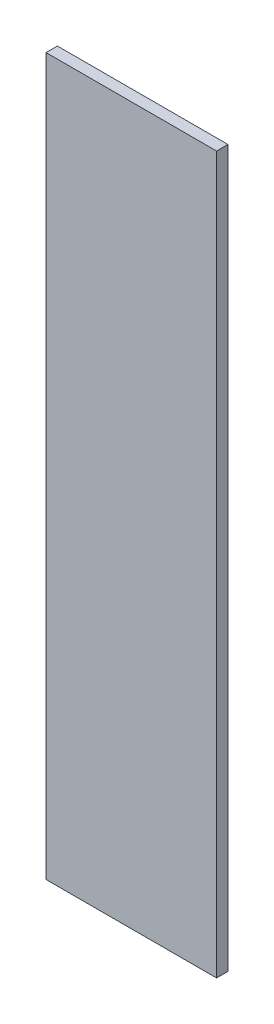
ISO-10303-21;
HEADER;
FILE_DESCRIPTION(('STEP AP214'),'2;1');
FILE_NAME('part.step','',(''),(''),'','','');
FILE_SCHEMA(('AUTOMOTIVE_DESIGN { 1 0 10303 214 1 1 1 1 }'));
ENDSEC;
DATA;
#1=APPLICATION_CONTEXT('core data for automotive mechanical design processes');
#2=APPLICATION_PROTOCOL_DEFINITION('international standard','automotive_design',2000,#1);
#3=PRODUCT_CONTEXT('',#1,'mechanical');
#4=PRODUCT('Part','Part','',(#3));
#5=PRODUCT_RELATED_PRODUCT_CATEGORY('part','',(#4));
#6=PRODUCT_DEFINITION_FORMATION('','',#4);
#7=PRODUCT_DEFINITION_CONTEXT('part definition',#1,'design');
#8=PRODUCT_DEFINITION('design','',#6,#7);
#9=PRODUCT_DEFINITION_SHAPE('','',#8);
#10=(LENGTH_UNIT() NAMED_UNIT(*) SI_UNIT(.MILLI.,.METRE.));
#11=(NAMED_UNIT(*) PLANE_ANGLE_UNIT() SI_UNIT($,.RADIAN.));
#12=(NAMED_UNIT(*) SI_UNIT($,.STERADIAN.) SOLID_ANGLE_UNIT());
#13=UNCERTAINTY_MEASURE_WITH_UNIT(LENGTH_MEASURE(1.E-05),#10,'distance_accuracy_value','');
#14=(GEOMETRIC_REPRESENTATION_CONTEXT(3) GLOBAL_UNCERTAINTY_ASSIGNED_CONTEXT((#13)) GLOBAL_UNIT_ASSIGNED_CONTEXT((#10,
#11,#12)) REPRESENTATION_CONTEXT('',''));
#15=CARTESIAN_POINT('',(0.,0.,0.));
#16=DIRECTION('',(0.,0.,1.));
#17=DIRECTION('',(1.,0.,0.));
#18=AXIS2_PLACEMENT_3D('',#15,#16,#17);
#19=CARTESIAN_POINT('',(0.,0.,2.));
#20=DIRECTION('',(1.,0.,0.));
#21=DIRECTION('',(0.,0.,-1.));
#22=AXIS2_PLACEMENT_3D('',#19,#20,#21);
#23=PLANE('',#22);
#24=DIRECTION('',(0.,-1.,0.));
#25=VECTOR('',#24,1.);
#26=CARTESIAN_POINT('',(0.,0.,0.));
#27=LINE('',#26,#25);
#28=CARTESIAN_POINT('',(0.,126.,0.));
#29=VERTEX_POINT('',#28);
#30=CARTESIAN_POINT('',(0.,0.,0.));
#31=VERTEX_POINT('',#30);
#32=EDGE_CURVE('E108',#29,#31,#27,.T.);
#33=ORIENTED_EDGE('',*,*,#32,.T.);
#34=DIRECTION('',(0.,0.,-1.));
#35=VECTOR('',#34,1.);
#36=CARTESIAN_POINT('',(0.,0.,2.));
#37=LINE('',#36,#35);
#38=CARTESIAN_POINT('',(0.,0.,2.));
#39=VERTEX_POINT('',#38);
#40=EDGE_CURVE('E11',#39,#31,#37,.T.);
#41=ORIENTED_EDGE('',*,*,#40,.F.);
#42=DIRECTION('',(0.,-1.,0.));
#43=VECTOR('',#42,1.);
#44=CARTESIAN_POINT('',(0.,0.,2.));
#45=LINE('',#44,#43);
#46=CARTESIAN_POINT('',(0.,126.,2.));
#47=VERTEX_POINT('',#46);
#48=EDGE_CURVE('E92',#47,#39,#45,.T.);
#49=ORIENTED_EDGE('',*,*,#48,.F.);
#50=DIRECTION('',(0.,0.,-1.));
#51=VECTOR('',#50,1.);
#52=CARTESIAN_POINT('',(0.,126.,2.));
#53=LINE('',#52,#51);
#54=EDGE_CURVE('E105',#47,#29,#53,.T.);
#55=ORIENTED_EDGE('',*,*,#54,.T.);
#56=EDGE_LOOP('',(#33,#41,#49,#55));
#57=FACE_BOUND('',#56,.T.);
#58=ADVANCED_FACE('F43',(#57),#23,.F.);
#59=CARTESIAN_POINT('',(0.,0.,2.));
#60=DIRECTION('',(0.,1.,0.));
#61=DIRECTION('',(0.,0.,1.));
#62=AXIS2_PLACEMENT_3D('',#59,#60,#61);
#63=PLANE('',#62);
#64=DIRECTION('',(1.,0.,0.));
#65=VECTOR('',#64,1.);
#66=CARTESIAN_POINT('',(0.,0.,0.));
#67=LINE('',#66,#65);
#68=CARTESIAN_POINT('',(30.,0.,0.));
#69=VERTEX_POINT('',#68);
#70=EDGE_CURVE('E97',#31,#69,#67,.T.);
#71=ORIENTED_EDGE('',*,*,#70,.T.);
#72=DIRECTION('',(0.,0.,-1.));
#73=VECTOR('',#72,1.);
#74=CARTESIAN_POINT('',(30.,0.,2.));
#75=LINE('',#74,#73);
#76=CARTESIAN_POINT('',(30.,0.,2.));
#77=VERTEX_POINT('',#76);
#78=EDGE_CURVE('E51',#77,#69,#75,.T.);
#79=ORIENTED_EDGE('',*,*,#78,.F.);
#80=DIRECTION('',(1.,0.,0.));
#81=VECTOR('',#80,1.);
#82=CARTESIAN_POINT('',(0.,0.,2.));
#83=LINE('',#82,#81);
#84=EDGE_CURVE('E87',#39,#77,#83,.T.);
#85=ORIENTED_EDGE('',*,*,#84,.F.);
#86=ORIENTED_EDGE('',*,*,#40,.T.);
#87=EDGE_LOOP('',(#71,#79,#85,#86));
#88=FACE_BOUND('',#87,.T.);
#89=ADVANCED_FACE('F100',(#88),#63,.F.);
#90=CARTESIAN_POINT('',(30.,0.,2.));
#91=DIRECTION('',(-1.,0.,0.));
#92=DIRECTION('',(0.,0.,1.));
#93=AXIS2_PLACEMENT_3D('',#90,#91,#92);
#94=PLANE('',#93);
#95=DIRECTION('',(0.,1.,0.));
#96=VECTOR('',#95,1.);
#97=CARTESIAN_POINT('',(30.,0.,0.));
#98=LINE('',#97,#96);
#99=CARTESIAN_POINT('',(30.,126.,0.));
#100=VERTEX_POINT('',#99);
#101=EDGE_CURVE('E78',#69,#100,#98,.T.);
#102=ORIENTED_EDGE('',*,*,#101,.T.);
#103=DIRECTION('',(0.,0.,-1.));
#104=VECTOR('',#103,1.);
#105=CARTESIAN_POINT('',(30.,126.,2.));
#106=LINE('',#105,#104);
#107=CARTESIAN_POINT('',(30.,126.,2.));
#108=VERTEX_POINT('',#107);
#109=EDGE_CURVE('E98',#108,#100,#106,.T.);
#110=ORIENTED_EDGE('',*,*,#109,.F.);
#111=DIRECTION('',(0.,1.,0.));
#112=VECTOR('',#111,1.);
#113=CARTESIAN_POINT('',(30.,0.,2.));
#114=LINE('',#113,#112);
#115=EDGE_CURVE('E95',#77,#108,#114,.T.);
#116=ORIENTED_EDGE('',*,*,#115,.F.);
#117=ORIENTED_EDGE('',*,*,#78,.T.);
#118=EDGE_LOOP('',(#102,#110,#116,#117));
#119=FACE_BOUND('',#118,.T.);
#120=ADVANCED_FACE('F99',(#119),#94,.F.);
#121=CARTESIAN_POINT('',(0.,126.,2.));
#122=DIRECTION('',(0.,-1.,0.));
#123=DIRECTION('',(0.,0.,-1.));
#124=AXIS2_PLACEMENT_3D('',#121,#122,#123);
#125=PLANE('',#124);
#126=DIRECTION('',(-1.,0.,0.));
#127=VECTOR('',#126,1.);
#128=CARTESIAN_POINT('',(0.,126.,0.));
#129=LINE('',#128,#127);
#130=EDGE_CURVE('E85',#100,#29,#129,.T.);
#131=ORIENTED_EDGE('',*,*,#130,.T.);
#132=ORIENTED_EDGE('',*,*,#54,.F.);
#133=DIRECTION('',(-1.,0.,0.));
#134=VECTOR('',#133,1.);
#135=CARTESIAN_POINT('',(0.,126.,2.));
#136=LINE('',#135,#134);
#137=EDGE_CURVE('E56',#108,#47,#136,.T.);
#138=ORIENTED_EDGE('',*,*,#137,.F.);
#139=ORIENTED_EDGE('',*,*,#109,.T.);
#140=EDGE_LOOP('',(#131,#132,#138,#139));
#141=FACE_BOUND('',#140,.T.);
#142=ADVANCED_FACE('F111',(#141),#125,.F.);
#143=CARTESIAN_POINT('',(0.,0.,2.));
#144=DIRECTION('',(0.,0.,-1.));
#145=DIRECTION('',(-1.,0.,0.));
#146=AXIS2_PLACEMENT_3D('',#143,#144,#145);
#147=PLANE('',#146);
#148=ORIENTED_EDGE('',*,*,#48,.T.);
#149=ORIENTED_EDGE('',*,*,#84,.T.);
#150=ORIENTED_EDGE('',*,*,#115,.T.);
#151=ORIENTED_EDGE('',*,*,#137,.T.);
#152=EDGE_LOOP('',(#148,#149,#150,#151));
#153=FACE_BOUND('',#152,.T.);
#154=ADVANCED_FACE('F89',(#153),#147,.F.);
#155=CARTESIAN_POINT('',(0.,0.,0.));
#156=DIRECTION('',(0.,0.,-1.));
#157=DIRECTION('',(-1.,0.,0.));
#158=AXIS2_PLACEMENT_3D('',#155,#156,#157);
#159=PLANE('',#158);
#160=ORIENTED_EDGE('',*,*,#32,.F.);
#161=ORIENTED_EDGE('',*,*,#130,.F.);
#162=ORIENTED_EDGE('',*,*,#101,.F.);
#163=ORIENTED_EDGE('',*,*,#70,.F.);
#164=EDGE_LOOP('',(#160,#161,#162,#163));
#165=FACE_BOUND('',#164,.T.);
#166=ADVANCED_FACE('F116',(#165),#159,.T.);
#167=CLOSED_SHELL('',(#58,#89,#120,#142,#154,#166));
#168=MANIFOLD_SOLID_BREP('B2',#167);
#169=ADVANCED_BREP_SHAPE_REPRESENTATION('',(#18,#168),#14);
#170=SHAPE_DEFINITION_REPRESENTATION(#9,#169);
ENDSEC;
END-ISO-10303-21;
